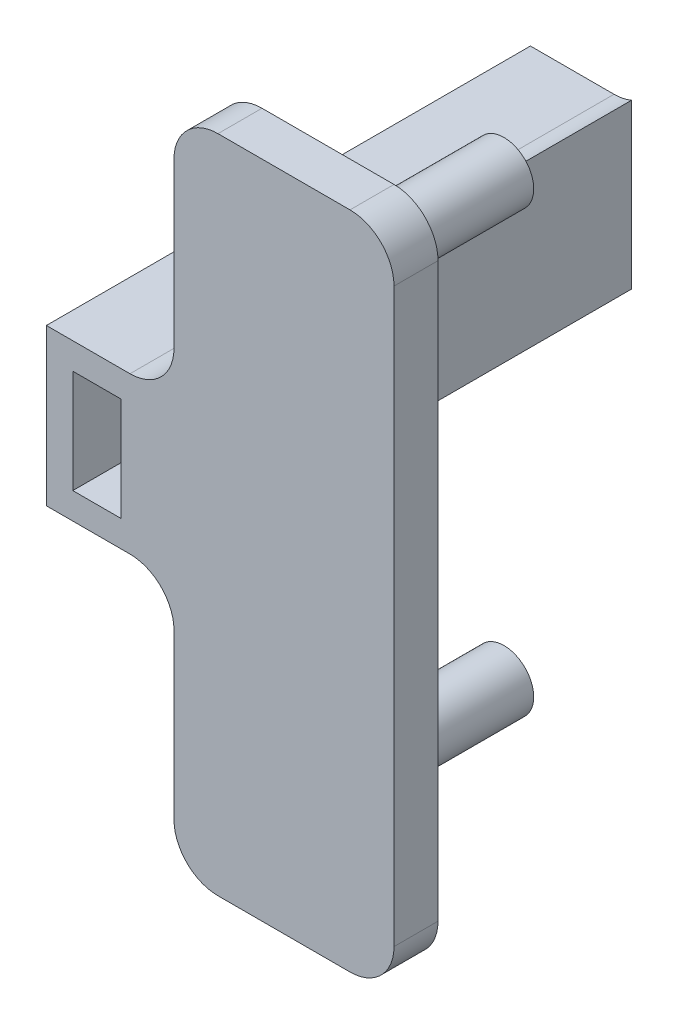
ISO-10303-21;
HEADER;
FILE_DESCRIPTION(('STEP AP214'),'2;1');
FILE_NAME('part.step','',(''),(''),'','','');
FILE_SCHEMA(('AUTOMOTIVE_DESIGN { 1 0 10303 214 1 1 1 1 }'));
ENDSEC;
DATA;
#1=APPLICATION_CONTEXT('core data for automotive mechanical design processes');
#2=APPLICATION_PROTOCOL_DEFINITION('international standard','automotive_design',2000,#1);
#3=PRODUCT_CONTEXT('',#1,'mechanical');
#4=PRODUCT('Part','Part','',(#3));
#5=PRODUCT_RELATED_PRODUCT_CATEGORY('part','',(#4));
#6=PRODUCT_DEFINITION_FORMATION('','',#4);
#7=PRODUCT_DEFINITION_CONTEXT('part definition',#1,'design');
#8=PRODUCT_DEFINITION('design','',#6,#7);
#9=PRODUCT_DEFINITION_SHAPE('','',#8);
#10=(LENGTH_UNIT() NAMED_UNIT(*) SI_UNIT(.MILLI.,.METRE.));
#11=(NAMED_UNIT(*) PLANE_ANGLE_UNIT() SI_UNIT($,.RADIAN.));
#12=(NAMED_UNIT(*) SI_UNIT($,.STERADIAN.) SOLID_ANGLE_UNIT());
#13=UNCERTAINTY_MEASURE_WITH_UNIT(LENGTH_MEASURE(1.E-05),#10,'distance_accuracy_value','');
#14=(GEOMETRIC_REPRESENTATION_CONTEXT(3) GLOBAL_UNCERTAINTY_ASSIGNED_CONTEXT((#13)) GLOBAL_UNIT_ASSIGNED_CONTEXT((#10,
#11,#12)) REPRESENTATION_CONTEXT('',''));
#15=CARTESIAN_POINT('',(0.,0.,0.));
#16=DIRECTION('',(0.,0.,1.));
#17=DIRECTION('',(1.,0.,0.));
#18=AXIS2_PLACEMENT_3D('',#15,#16,#17);
#19=CARTESIAN_POINT('',(0.,0.,0.));
#20=DIRECTION('',(0.,0.,-1.));
#21=DIRECTION('',(-1.,0.,0.));
#22=AXIS2_PLACEMENT_3D('',#19,#20,#21);
#23=PLANE('',#22);
#24=CARTESIAN_POINT('',(44.,65.,0.));
#25=DIRECTION('',(0.,0.,-1.));
#26=DIRECTION('',(-1.,0.,0.));
#27=AXIS2_PLACEMENT_3D('',#24,#25,#26);
#28=CIRCLE('',#27,1.35);
#29=CARTESIAN_POINT('',(42.65,65.,0.));
#30=VERTEX_POINT('',#29);
#31=EDGE_CURVE('E215',#30,#30,#28,.T.);
#32=ORIENTED_EDGE('',*,*,#31,.F.);
#33=EDGE_LOOP('',(#32));
#34=FACE_BOUND('',#33,.T.);
#35=CARTESIAN_POINT('',(44.,45.,0.));
#36=DIRECTION('',(0.,0.,-1.));
#37=DIRECTION('',(-1.,0.,0.));
#38=AXIS2_PLACEMENT_3D('',#35,#36,#37);
#39=CIRCLE('',#38,1.35);
#40=CARTESIAN_POINT('',(42.65,45.,0.));
#41=VERTEX_POINT('',#40);
#42=EDGE_CURVE('E222',#41,#41,#39,.T.);
#43=ORIENTED_EDGE('',*,*,#42,.F.);
#44=EDGE_LOOP('',(#43));
#45=FACE_BOUND('',#44,.T.);
#46=DIRECTION('',(0.,-1.,0.));
#47=VECTOR('',#46,1.);
#48=CARTESIAN_POINT('',(39.7,51.2830302779823,0.));
#49=LINE('',#48,#47);
#50=CARTESIAN_POINT('',(39.7,58.7169697220176,0.));
#51=VERTEX_POINT('',#50);
#52=CARTESIAN_POINT('',(39.7,51.2830302779823,0.));
#53=VERTEX_POINT('',#52);
#54=EDGE_CURVE('E52',#51,#53,#49,.T.);
#55=ORIENTED_EDGE('',*,*,#54,.F.);
#56=DIRECTION('',(1.,0.,0.));
#57=VECTOR('',#56,1.);
#58=CARTESIAN_POINT('',(39.7,58.7169697220176,0.));
#59=LINE('',#58,#57);
#60=CARTESIAN_POINT('',(37.8,58.7169697220176,0.));
#61=VERTEX_POINT('',#60);
#62=EDGE_CURVE('E211',#61,#51,#59,.T.);
#63=ORIENTED_EDGE('',*,*,#62,.F.);
#64=CARTESIAN_POINT('',(37.,60.55,0.));
#65=DIRECTION('',(0.,0.,-1.));
#66=DIRECTION('',(-1.,0.,0.));
#67=AXIS2_PLACEMENT_3D('',#64,#65,#66);
#68=CIRCLE('',#67,2.);
#69=CARTESIAN_POINT('',(39.,60.55,0.));
#70=VERTEX_POINT('',#69);
#71=EDGE_CURVE('E367',#61,#70,#68,.F.);
#72=ORIENTED_EDGE('',*,*,#71,.T.);
#73=DIRECTION('',(0.,-1.,0.));
#74=VECTOR('',#73,1.);
#75=CARTESIAN_POINT('',(39.,70.,0.));
#76=LINE('',#75,#74);
#77=CARTESIAN_POINT('',(39.,68.,0.));
#78=VERTEX_POINT('',#77);
#79=EDGE_CURVE('E303',#78,#70,#76,.T.);
#80=ORIENTED_EDGE('',*,*,#79,.F.);
#81=CARTESIAN_POINT('',(41.,68.,0.));
#82=DIRECTION('',(0.,0.,-1.));
#83=DIRECTION('',(-1.,0.,0.));
#84=AXIS2_PLACEMENT_3D('',#81,#82,#83);
#85=CIRCLE('',#84,2.);
#86=CARTESIAN_POINT('',(41.,70.,0.));
#87=VERTEX_POINT('',#86);
#88=EDGE_CURVE('E320',#78,#87,#85,.T.);
#89=ORIENTED_EDGE('',*,*,#88,.T.);
#90=DIRECTION('',(-1.,0.,0.));
#91=VECTOR('',#90,1.);
#92=CARTESIAN_POINT('',(49.,70.,0.));
#93=LINE('',#92,#91);
#94=CARTESIAN_POINT('',(47.,70.,0.));
#95=VERTEX_POINT('',#94);
#96=EDGE_CURVE('E300',#95,#87,#93,.T.);
#97=ORIENTED_EDGE('',*,*,#96,.F.);
#98=CARTESIAN_POINT('',(47.,68.,0.));
#99=DIRECTION('',(0.,0.,-1.));
#100=DIRECTION('',(-1.,0.,0.));
#101=AXIS2_PLACEMENT_3D('',#98,#99,#100);
#102=CIRCLE('',#101,2.);
#103=CARTESIAN_POINT('',(49.,68.,0.));
#104=VERTEX_POINT('',#103);
#105=EDGE_CURVE('E326',#95,#104,#102,.T.);
#106=ORIENTED_EDGE('',*,*,#105,.T.);
#107=DIRECTION('',(0.,1.,0.));
#108=VECTOR('',#107,1.);
#109=CARTESIAN_POINT('',(49.,70.,0.));
#110=LINE('',#109,#108);
#111=CARTESIAN_POINT('',(49.,42.,0.));
#112=VERTEX_POINT('',#111);
#113=EDGE_CURVE('E273',#112,#104,#110,.T.);
#114=ORIENTED_EDGE('',*,*,#113,.F.);
#115=CARTESIAN_POINT('',(47.,42.,0.));
#116=DIRECTION('',(0.,0.,-1.));
#117=DIRECTION('',(-1.,0.,0.));
#118=AXIS2_PLACEMENT_3D('',#115,#116,#117);
#119=CIRCLE('',#118,2.);
#120=CARTESIAN_POINT('',(47.,40.,0.));
#121=VERTEX_POINT('',#120);
#122=EDGE_CURVE('E324',#112,#121,#119,.T.);
#123=ORIENTED_EDGE('',*,*,#122,.T.);
#124=DIRECTION('',(1.,0.,0.));
#125=VECTOR('',#124,1.);
#126=CARTESIAN_POINT('',(49.,40.,0.));
#127=LINE('',#126,#125);
#128=CARTESIAN_POINT('',(41.,40.,0.));
#129=VERTEX_POINT('',#128);
#130=EDGE_CURVE('E278',#129,#121,#127,.T.);
#131=ORIENTED_EDGE('',*,*,#130,.F.);
#132=CARTESIAN_POINT('',(41.,42.,0.));
#133=DIRECTION('',(0.,0.,-1.));
#134=DIRECTION('',(-1.,0.,0.));
#135=AXIS2_PLACEMENT_3D('',#132,#133,#134);
#136=CIRCLE('',#135,2.);
#137=CARTESIAN_POINT('',(39.,42.,0.));
#138=VERTEX_POINT('',#137);
#139=EDGE_CURVE('E322',#129,#138,#136,.T.);
#140=ORIENTED_EDGE('',*,*,#139,.T.);
#141=DIRECTION('',(0.,-1.,0.));
#142=VECTOR('',#141,1.);
#143=CARTESIAN_POINT('',(39.,51.45,0.));
#144=LINE('',#143,#142);
#145=CARTESIAN_POINT('',(39.,49.45,0.));
#146=VERTEX_POINT('',#145);
#147=EDGE_CURVE('E306',#146,#138,#144,.T.);
#148=ORIENTED_EDGE('',*,*,#147,.F.);
#149=CARTESIAN_POINT('',(37.,49.45,0.));
#150=DIRECTION('',(0.,0.,-1.));
#151=DIRECTION('',(-1.,0.,0.));
#152=AXIS2_PLACEMENT_3D('',#149,#150,#151);
#153=CIRCLE('',#152,2.);
#154=CARTESIAN_POINT('',(37.8,51.2830302779823,0.));
#155=VERTEX_POINT('',#154);
#156=EDGE_CURVE('E371',#146,#155,#153,.F.);
#157=ORIENTED_EDGE('',*,*,#156,.T.);
#158=DIRECTION('',(-1.,0.,0.));
#159=VECTOR('',#158,1.);
#160=CARTESIAN_POINT('',(37.8,51.2830302779823,0.));
#161=LINE('',#160,#159);
#162=EDGE_CURVE('E57',#53,#155,#161,.T.);
#163=ORIENTED_EDGE('',*,*,#162,.F.);
#164=EDGE_LOOP('',(#55,#63,#72,#80,#89,#97,#106,#114,#123,#131,#140,#148,#157,#163));
#165=FACE_BOUND('',#164,.T.);
#166=ADVANCED_FACE('F37',(#34,#45,#165),#23,.T.);
#167=CARTESIAN_POINT('',(37.8,51.45,-20.));
#168=DIRECTION('',(-1.,0.,0.));
#169=DIRECTION('',(0.,0.,1.));
#170=AXIS2_PLACEMENT_3D('',#167,#168,#169);
#171=PLANE('',#170);
#172=DIRECTION('',(0.,1.,0.));
#173=VECTOR('',#172,1.);
#174=CARTESIAN_POINT('',(37.8,58.7169697220176,-8.));
#175=LINE('',#174,#173);
#176=CARTESIAN_POINT('',(37.8,51.2830302779823,-8.));
#177=VERTEX_POINT('',#176);
#178=CARTESIAN_POINT('',(37.8,58.7169697220176,-8.));
#179=VERTEX_POINT('',#178);
#180=EDGE_CURVE('E206',#177,#179,#175,.T.);
#181=ORIENTED_EDGE('',*,*,#180,.F.);
#182=DIRECTION('',(0.,0.,1.));
#183=VECTOR('',#182,1.);
#184=CARTESIAN_POINT('',(37.8,51.2830302779823,0.));
#185=LINE('',#184,#183);
#186=CARTESIAN_POINT('',(37.8,51.2830302779823,-20.));
#187=VERTEX_POINT('',#186);
#188=EDGE_CURVE('E373',#177,#187,#185,.F.);
#189=ORIENTED_EDGE('',*,*,#188,.T.);
#190=DIRECTION('',(0.,-1.,0.));
#191=VECTOR('',#190,1.);
#192=CARTESIAN_POINT('',(37.8,51.45,-20.));
#193=LINE('',#192,#191);
#194=CARTESIAN_POINT('',(37.8,58.7169697220176,-20.));
#195=VERTEX_POINT('',#194);
#196=EDGE_CURVE('E247',#195,#187,#193,.T.);
#197=ORIENTED_EDGE('',*,*,#196,.F.);
#198=DIRECTION('',(0.,0.,1.));
#199=VECTOR('',#198,1.);
#200=CARTESIAN_POINT('',(37.8,58.7169697220176,-20.));
#201=LINE('',#200,#199);
#202=EDGE_CURVE('E364',#195,#179,#201,.T.);
#203=ORIENTED_EDGE('',*,*,#202,.T.);
#204=EDGE_LOOP('',(#181,#189,#197,#203));
#205=FACE_BOUND('',#204,.T.);
#206=ADVANCED_FACE('F448',(#205),#171,.F.);
#207=CARTESIAN_POINT('',(34.4,57.35,2.));
#208=DIRECTION('',(1.,0.,0.));
#209=DIRECTION('',(0.,0.,-1.));
#210=AXIS2_PLACEMENT_3D('',#207,#208,#209);
#211=PLANE('',#210);
#212=DIRECTION('',(0.,0.,-1.));
#213=VECTOR('',#212,1.);
#214=CARTESIAN_POINT('',(34.4,52.65,2.));
#215=LINE('',#214,#213);
#216=CARTESIAN_POINT('',(34.4,52.65,2.));
#217=VERTEX_POINT('',#216);
#218=CARTESIAN_POINT('',(34.4,52.65,-19.));
#219=VERTEX_POINT('',#218);
#220=EDGE_CURVE('E270',#217,#219,#215,.T.);
#221=ORIENTED_EDGE('',*,*,#220,.T.);
#222=DIRECTION('',(0.,1.,0.));
#223=VECTOR('',#222,1.);
#224=CARTESIAN_POINT('',(34.4,52.65,-19.));
#225=LINE('',#224,#223);
#226=CARTESIAN_POINT('',(34.4,57.35,-19.));
#227=VERTEX_POINT('',#226);
#228=EDGE_CURVE('E227',#219,#227,#225,.T.);
#229=ORIENTED_EDGE('',*,*,#228,.T.);
#230=DIRECTION('',(0.,0.,-1.));
#231=VECTOR('',#230,1.);
#232=CARTESIAN_POINT('',(34.4,57.35,2.));
#233=LINE('',#232,#231);
#234=CARTESIAN_POINT('',(34.4,57.35,2.));
#235=VERTEX_POINT('',#234);
#236=EDGE_CURVE('E261',#235,#227,#233,.T.);
#237=ORIENTED_EDGE('',*,*,#236,.F.);
#238=DIRECTION('',(0.,-1.,0.));
#239=VECTOR('',#238,1.);
#240=CARTESIAN_POINT('',(34.4,57.35,2.));
#241=LINE('',#240,#239);
#242=EDGE_CURVE('E252',#235,#217,#241,.T.);
#243=ORIENTED_EDGE('',*,*,#242,.T.);
#244=EDGE_LOOP('',(#221,#229,#237,#243));
#245=FACE_BOUND('',#244,.T.);
#246=ADVANCED_FACE('F471',(#245),#211,.T.);
#247=CARTESIAN_POINT('',(36.6,52.65,2.));
#248=DIRECTION('',(0.,1.,0.));
#249=DIRECTION('',(0.,0.,1.));
#250=AXIS2_PLACEMENT_3D('',#247,#248,#249);
#251=PLANE('',#250);
#252=DIRECTION('',(0.,0.,-1.));
#253=VECTOR('',#252,1.);
#254=CARTESIAN_POINT('',(36.6,52.65,2.));
#255=LINE('',#254,#253);
#256=CARTESIAN_POINT('',(36.6,52.65,2.));
#257=VERTEX_POINT('',#256);
#258=CARTESIAN_POINT('',(36.6,52.65,-19.));
#259=VERTEX_POINT('',#258);
#260=EDGE_CURVE('E267',#257,#259,#255,.T.);
#261=ORIENTED_EDGE('',*,*,#260,.T.);
#262=DIRECTION('',(-1.,0.,0.));
#263=VECTOR('',#262,1.);
#264=CARTESIAN_POINT('',(36.6,52.65,-19.));
#265=LINE('',#264,#263);
#266=EDGE_CURVE('E238',#259,#219,#265,.T.);
#267=ORIENTED_EDGE('',*,*,#266,.T.);
#268=ORIENTED_EDGE('',*,*,#220,.F.);
#269=DIRECTION('',(1.,0.,0.));
#270=VECTOR('',#269,1.);
#271=CARTESIAN_POINT('',(36.6,52.65,2.));
#272=LINE('',#271,#270);
#273=EDGE_CURVE('E254',#217,#257,#272,.T.);
#274=ORIENTED_EDGE('',*,*,#273,.T.);
#275=EDGE_LOOP('',(#261,#267,#268,#274));
#276=FACE_BOUND('',#275,.T.);
#277=ADVANCED_FACE('F541',(#276),#251,.T.);
#278=CARTESIAN_POINT('',(36.6,57.35,2.));
#279=DIRECTION('',(-1.,0.,0.));
#280=DIRECTION('',(0.,0.,1.));
#281=AXIS2_PLACEMENT_3D('',#278,#279,#280);
#282=PLANE('',#281);
#283=DIRECTION('',(0.,0.,-1.));
#284=VECTOR('',#283,1.);
#285=CARTESIAN_POINT('',(36.6,57.35,2.));
#286=LINE('',#285,#284);
#287=CARTESIAN_POINT('',(36.6,57.35,2.));
#288=VERTEX_POINT('',#287);
#289=CARTESIAN_POINT('',(36.6,57.35,-19.));
#290=VERTEX_POINT('',#289);
#291=EDGE_CURVE('E264',#288,#290,#286,.T.);
#292=ORIENTED_EDGE('',*,*,#291,.T.);
#293=DIRECTION('',(0.,-1.,0.));
#294=VECTOR('',#293,1.);
#295=CARTESIAN_POINT('',(36.6,57.35,-19.));
#296=LINE('',#295,#294);
#297=EDGE_CURVE('E235',#290,#259,#296,.T.);
#298=ORIENTED_EDGE('',*,*,#297,.T.);
#299=ORIENTED_EDGE('',*,*,#260,.F.);
#300=DIRECTION('',(0.,1.,0.));
#301=VECTOR('',#300,1.);
#302=CARTESIAN_POINT('',(36.6,57.35,2.));
#303=LINE('',#302,#301);
#304=EDGE_CURVE('E256',#257,#288,#303,.T.);
#305=ORIENTED_EDGE('',*,*,#304,.T.);
#306=EDGE_LOOP('',(#292,#298,#299,#305));
#307=FACE_BOUND('',#306,.T.);
#308=ADVANCED_FACE('F537',(#307),#282,.T.);
#309=CARTESIAN_POINT('',(36.6,57.35,2.));
#310=DIRECTION('',(0.,-1.,0.));
#311=DIRECTION('',(0.,0.,-1.));
#312=AXIS2_PLACEMENT_3D('',#309,#310,#311);
#313=PLANE('',#312);
#314=ORIENTED_EDGE('',*,*,#236,.T.);
#315=DIRECTION('',(1.,0.,0.));
#316=VECTOR('',#315,1.);
#317=CARTESIAN_POINT('',(34.4,57.35,-19.));
#318=LINE('',#317,#316);
#319=EDGE_CURVE('E232',#227,#290,#318,.T.);
#320=ORIENTED_EDGE('',*,*,#319,.T.);
#321=ORIENTED_EDGE('',*,*,#291,.F.);
#322=DIRECTION('',(-1.,0.,0.));
#323=VECTOR('',#322,1.);
#324=CARTESIAN_POINT('',(36.6,57.35,2.));
#325=LINE('',#324,#323);
#326=EDGE_CURVE('E259',#288,#235,#325,.T.);
#327=ORIENTED_EDGE('',*,*,#326,.T.);
#328=EDGE_LOOP('',(#314,#320,#321,#327));
#329=FACE_BOUND('',#328,.T.);
#330=ADVANCED_FACE('F534',(#329),#313,.T.);
#331=CARTESIAN_POINT('',(0.,0.,2.));
#332=DIRECTION('',(0.,0.,-1.));
#333=DIRECTION('',(-1.,0.,0.));
#334=AXIS2_PLACEMENT_3D('',#331,#332,#333);
#335=PLANE('',#334);
#336=DIRECTION('',(0.,1.,0.));
#337=VECTOR('',#336,1.);
#338=CARTESIAN_POINT('',(49.,70.,2.));
#339=LINE('',#338,#337);
#340=CARTESIAN_POINT('',(49.,42.,2.));
#341=VERTEX_POINT('',#340);
#342=CARTESIAN_POINT('',(49.,68.,2.));
#343=VERTEX_POINT('',#342);
#344=EDGE_CURVE('E274',#341,#343,#339,.T.);
#345=ORIENTED_EDGE('',*,*,#344,.T.);
#346=CARTESIAN_POINT('',(47.,68.,2.));
#347=DIRECTION('',(0.,0.,-1.));
#348=DIRECTION('',(-1.,0.,0.));
#349=AXIS2_PLACEMENT_3D('',#346,#347,#348);
#350=CIRCLE('',#349,2.);
#351=CARTESIAN_POINT('',(47.,70.,2.));
#352=VERTEX_POINT('',#351);
#353=EDGE_CURVE('E339',#343,#352,#350,.F.);
#354=ORIENTED_EDGE('',*,*,#353,.T.);
#355=DIRECTION('',(-1.,0.,0.));
#356=VECTOR('',#355,1.);
#357=CARTESIAN_POINT('',(49.,70.,2.));
#358=LINE('',#357,#356);
#359=CARTESIAN_POINT('',(41.,70.,2.));
#360=VERTEX_POINT('',#359);
#361=EDGE_CURVE('E277',#352,#360,#358,.T.);
#362=ORIENTED_EDGE('',*,*,#361,.T.);
#363=CARTESIAN_POINT('',(41.,68.,2.));
#364=DIRECTION('',(0.,0.,-1.));
#365=DIRECTION('',(-1.,0.,0.));
#366=AXIS2_PLACEMENT_3D('',#363,#364,#365);
#367=CIRCLE('',#366,2.);
#368=CARTESIAN_POINT('',(39.,68.,2.));
#369=VERTEX_POINT('',#368);
#370=EDGE_CURVE('E333',#360,#369,#367,.F.);
#371=ORIENTED_EDGE('',*,*,#370,.T.);
#372=DIRECTION('',(0.,-1.,0.));
#373=VECTOR('',#372,1.);
#374=CARTESIAN_POINT('',(39.,70.,2.));
#375=LINE('',#374,#373);
#376=CARTESIAN_POINT('',(39.,60.55,2.));
#377=VERTEX_POINT('',#376);
#378=EDGE_CURVE('E281',#369,#377,#375,.T.);
#379=ORIENTED_EDGE('',*,*,#378,.T.);
#380=CARTESIAN_POINT('',(37.,60.55,2.));
#381=DIRECTION('',(0.,0.,-1.));
#382=DIRECTION('',(-1.,0.,0.));
#383=AXIS2_PLACEMENT_3D('',#380,#381,#382);
#384=CIRCLE('',#383,2.);
#385=CARTESIAN_POINT('',(37.,58.55,2.));
#386=VERTEX_POINT('',#385);
#387=EDGE_CURVE('E369',#377,#386,#384,.T.);
#388=ORIENTED_EDGE('',*,*,#387,.T.);
#389=DIRECTION('',(-1.,0.,0.));
#390=VECTOR('',#389,1.);
#391=CARTESIAN_POINT('',(33.2,58.55,2.));
#392=LINE('',#391,#390);
#393=CARTESIAN_POINT('',(33.2,58.55,2.));
#394=VERTEX_POINT('',#393);
#395=EDGE_CURVE('E284',#386,#394,#392,.T.);
#396=ORIENTED_EDGE('',*,*,#395,.T.);
#397=DIRECTION('',(0.,-1.,0.));
#398=VECTOR('',#397,1.);
#399=CARTESIAN_POINT('',(33.2,58.55,2.));
#400=LINE('',#399,#398);
#401=CARTESIAN_POINT('',(33.2,51.45,2.));
#402=VERTEX_POINT('',#401);
#403=EDGE_CURVE('E286',#394,#402,#400,.T.);
#404=ORIENTED_EDGE('',*,*,#403,.T.);
#405=DIRECTION('',(1.,0.,0.));
#406=VECTOR('',#405,1.);
#407=CARTESIAN_POINT('',(33.2,51.45,2.));
#408=LINE('',#407,#406);
#409=CARTESIAN_POINT('',(37.,51.45,2.));
#410=VERTEX_POINT('',#409);
#411=EDGE_CURVE('E288',#402,#410,#408,.T.);
#412=ORIENTED_EDGE('',*,*,#411,.T.);
#413=CARTESIAN_POINT('',(37.,49.45,2.));
#414=DIRECTION('',(0.,0.,-1.));
#415=DIRECTION('',(-1.,0.,0.));
#416=AXIS2_PLACEMENT_3D('',#413,#414,#415);
#417=CIRCLE('',#416,2.);
#418=CARTESIAN_POINT('',(39.,49.45,2.));
#419=VERTEX_POINT('',#418);
#420=EDGE_CURVE('E11',#410,#419,#417,.T.);
#421=ORIENTED_EDGE('',*,*,#420,.T.);
#422=DIRECTION('',(0.,-1.,0.));
#423=VECTOR('',#422,1.);
#424=CARTESIAN_POINT('',(39.,51.45,2.));
#425=LINE('',#424,#423);
#426=CARTESIAN_POINT('',(39.,42.,2.));
#427=VERTEX_POINT('',#426);
#428=EDGE_CURVE('E291',#419,#427,#425,.T.);
#429=ORIENTED_EDGE('',*,*,#428,.T.);
#430=CARTESIAN_POINT('',(41.,42.,2.));
#431=DIRECTION('',(0.,0.,-1.));
#432=DIRECTION('',(-1.,0.,0.));
#433=AXIS2_PLACEMENT_3D('',#430,#431,#432);
#434=CIRCLE('',#433,2.);
#435=CARTESIAN_POINT('',(41.,40.,2.));
#436=VERTEX_POINT('',#435);
#437=EDGE_CURVE('E335',#427,#436,#434,.F.);
#438=ORIENTED_EDGE('',*,*,#437,.T.);
#439=DIRECTION('',(1.,0.,0.));
#440=VECTOR('',#439,1.);
#441=CARTESIAN_POINT('',(49.,40.,2.));
#442=LINE('',#441,#440);
#443=CARTESIAN_POINT('',(47.,40.,2.));
#444=VERTEX_POINT('',#443);
#445=EDGE_CURVE('E294',#436,#444,#442,.T.);
#446=ORIENTED_EDGE('',*,*,#445,.T.);
#447=CARTESIAN_POINT('',(47.,42.,2.));
#448=DIRECTION('',(0.,0.,-1.));
#449=DIRECTION('',(-1.,0.,0.));
#450=AXIS2_PLACEMENT_3D('',#447,#448,#449);
#451=CIRCLE('',#450,2.);
#452=EDGE_CURVE('E337',#444,#341,#451,.F.);
#453=ORIENTED_EDGE('',*,*,#452,.T.);
#454=EDGE_LOOP('',(#345,#354,#362,#371,#379,#388,#396,#404,#412,#421,#429,#438,#446,#453));
#455=FACE_BOUND('',#454,.T.);
#456=ORIENTED_EDGE('',*,*,#242,.F.);
#457=ORIENTED_EDGE('',*,*,#326,.F.);
#458=ORIENTED_EDGE('',*,*,#304,.F.);
#459=ORIENTED_EDGE('',*,*,#273,.F.);
#460=EDGE_LOOP('',(#456,#457,#458,#459));
#461=FACE_BOUND('',#460,.T.);
#462=ADVANCED_FACE('F391',(#455,#461),#335,.F.);
#463=CARTESIAN_POINT('',(49.,70.,2.));
#464=DIRECTION('',(-1.,0.,0.));
#465=DIRECTION('',(0.,-1.,0.));
#466=AXIS2_PLACEMENT_3D('',#463,#464,#465);
#467=PLANE('',#466);
#468=ORIENTED_EDGE('',*,*,#113,.T.);
#469=DIRECTION('',(0.,0.,-1.));
#470=VECTOR('',#469,1.);
#471=CARTESIAN_POINT('',(49.,68.,2.));
#472=LINE('',#471,#470);
#473=EDGE_CURVE('E331',#104,#343,#472,.F.);
#474=ORIENTED_EDGE('',*,*,#473,.T.);
#475=ORIENTED_EDGE('',*,*,#344,.F.);
#476=DIRECTION('',(0.,0.,-1.));
#477=VECTOR('',#476,1.);
#478=CARTESIAN_POINT('',(49.,42.,2.));
#479=LINE('',#478,#477);
#480=EDGE_CURVE('E328',#341,#112,#479,.T.);
#481=ORIENTED_EDGE('',*,*,#480,.T.);
#482=EDGE_LOOP('',(#468,#474,#475,#481));
#483=FACE_BOUND('',#482,.T.);
#484=ADVANCED_FACE('F413',(#483),#467,.F.);
#485=CARTESIAN_POINT('',(49.,70.,2.));
#486=DIRECTION('',(0.,-1.,0.));
#487=DIRECTION('',(0.,0.,-1.));
#488=AXIS2_PLACEMENT_3D('',#485,#486,#487);
#489=PLANE('',#488);
#490=ORIENTED_EDGE('',*,*,#361,.F.);
#491=DIRECTION('',(0.,0.,-1.));
#492=VECTOR('',#491,1.);
#493=CARTESIAN_POINT('',(47.,70.,2.));
#494=LINE('',#493,#492);
#495=EDGE_CURVE('E317',#352,#95,#494,.T.);
#496=ORIENTED_EDGE('',*,*,#495,.T.);
#497=ORIENTED_EDGE('',*,*,#96,.T.);
#498=DIRECTION('',(0.,0.,-1.));
#499=VECTOR('',#498,1.);
#500=CARTESIAN_POINT('',(41.,70.,2.));
#501=LINE('',#500,#499);
#502=EDGE_CURVE('E315',#87,#360,#501,.F.);
#503=ORIENTED_EDGE('',*,*,#502,.T.);
#504=EDGE_LOOP('',(#490,#496,#497,#503));
#505=FACE_BOUND('',#504,.T.);
#506=ADVANCED_FACE('F422',(#505),#489,.F.);
#507=CARTESIAN_POINT('',(39.,70.,2.));
#508=DIRECTION('',(1.,0.,0.));
#509=DIRECTION('',(0.,0.,-1.));
#510=AXIS2_PLACEMENT_3D('',#507,#508,#509);
#511=PLANE('',#510);
#512=ORIENTED_EDGE('',*,*,#378,.F.);
#513=DIRECTION('',(0.,0.,-1.));
#514=VECTOR('',#513,1.);
#515=CARTESIAN_POINT('',(39.,68.,2.));
#516=LINE('',#515,#514);
#517=EDGE_CURVE('E353',#369,#78,#516,.T.);
#518=ORIENTED_EDGE('',*,*,#517,.T.);
#519=ORIENTED_EDGE('',*,*,#79,.T.);
#520=DIRECTION('',(0.,0.,-1.));
#521=VECTOR('',#520,1.);
#522=CARTESIAN_POINT('',(39.,60.55,2.));
#523=LINE('',#522,#521);
#524=EDGE_CURVE('E351',#70,#377,#523,.F.);
#525=ORIENTED_EDGE('',*,*,#524,.T.);
#526=EDGE_LOOP('',(#512,#518,#519,#525));
#527=FACE_BOUND('',#526,.T.);
#528=ADVANCED_FACE('F431',(#527),#511,.F.);
#529=CARTESIAN_POINT('',(33.2,58.55,2.));
#530=DIRECTION('',(0.,-1.,0.));
#531=DIRECTION('',(0.,0.,-1.));
#532=AXIS2_PLACEMENT_3D('',#529,#530,#531);
#533=PLANE('',#532);
#534=ORIENTED_EDGE('',*,*,#395,.F.);
#535=DIRECTION('',(0.,0.,-1.));
#536=VECTOR('',#535,1.);
#537=CARTESIAN_POINT('',(37.,58.55,0.));
#538=LINE('',#537,#536);
#539=CARTESIAN_POINT('',(37.,58.55,-20.));
#540=VERTEX_POINT('',#539);
#541=EDGE_CURVE('E356',#386,#540,#538,.T.);
#542=ORIENTED_EDGE('',*,*,#541,.T.);
#543=DIRECTION('',(1.,0.,0.));
#544=VECTOR('',#543,1.);
#545=CARTESIAN_POINT('',(33.2,58.55,-20.));
#546=LINE('',#545,#544);
#547=CARTESIAN_POINT('',(33.2,58.55,-20.));
#548=VERTEX_POINT('',#547);
#549=EDGE_CURVE('E244',#548,#540,#546,.T.);
#550=ORIENTED_EDGE('',*,*,#549,.F.);
#551=DIRECTION('',(0.,0.,-1.));
#552=VECTOR('',#551,1.);
#553=CARTESIAN_POINT('',(33.2,58.55,2.));
#554=LINE('',#553,#552);
#555=EDGE_CURVE('E313',#394,#548,#554,.T.);
#556=ORIENTED_EDGE('',*,*,#555,.F.);
#557=EDGE_LOOP('',(#534,#542,#550,#556));
#558=FACE_BOUND('',#557,.T.);
#559=ADVANCED_FACE('F441',(#558),#533,.F.);
#560=CARTESIAN_POINT('',(33.2,58.55,2.));
#561=DIRECTION('',(1.,0.,0.));
#562=DIRECTION('',(0.,0.,-1.));
#563=AXIS2_PLACEMENT_3D('',#560,#561,#562);
#564=PLANE('',#563);
#565=ORIENTED_EDGE('',*,*,#555,.T.);
#566=DIRECTION('',(0.,1.,0.));
#567=VECTOR('',#566,1.);
#568=CARTESIAN_POINT('',(33.2,51.45,-20.));
#569=LINE('',#568,#567);
#570=CARTESIAN_POINT('',(33.2,51.45,-20.));
#571=VERTEX_POINT('',#570);
#572=EDGE_CURVE('E241',#571,#548,#569,.T.);
#573=ORIENTED_EDGE('',*,*,#572,.F.);
#574=DIRECTION('',(0.,0.,-1.));
#575=VECTOR('',#574,1.);
#576=CARTESIAN_POINT('',(33.2,51.45,2.));
#577=LINE('',#576,#575);
#578=EDGE_CURVE('E297',#402,#571,#577,.T.);
#579=ORIENTED_EDGE('',*,*,#578,.F.);
#580=ORIENTED_EDGE('',*,*,#403,.F.);
#581=EDGE_LOOP('',(#565,#573,#579,#580));
#582=FACE_BOUND('',#581,.T.);
#583=ADVANCED_FACE('F445',(#582),#564,.F.);
#584=CARTESIAN_POINT('',(33.2,51.45,2.));
#585=DIRECTION('',(0.,1.,0.));
#586=DIRECTION('',(0.,0.,1.));
#587=AXIS2_PLACEMENT_3D('',#584,#585,#586);
#588=PLANE('',#587);
#589=DIRECTION('',(-1.,0.,0.));
#590=VECTOR('',#589,1.);
#591=CARTESIAN_POINT('',(33.2,51.45,-20.));
#592=LINE('',#591,#590);
#593=CARTESIAN_POINT('',(37.,51.45,-20.));
#594=VERTEX_POINT('',#593);
#595=EDGE_CURVE('E250',#594,#571,#592,.T.);
#596=ORIENTED_EDGE('',*,*,#595,.F.);
#597=DIRECTION('',(0.,0.,-1.));
#598=VECTOR('',#597,1.);
#599=CARTESIAN_POINT('',(37.,51.45,2.));
#600=LINE('',#599,#598);
#601=EDGE_CURVE('E359',#594,#410,#600,.F.);
#602=ORIENTED_EDGE('',*,*,#601,.T.);
#603=ORIENTED_EDGE('',*,*,#411,.F.);
#604=ORIENTED_EDGE('',*,*,#578,.T.);
#605=EDGE_LOOP('',(#596,#602,#603,#604));
#606=FACE_BOUND('',#605,.T.);
#607=ADVANCED_FACE('F383',(#606),#588,.F.);
#608=CARTESIAN_POINT('',(39.,51.45,2.));
#609=DIRECTION('',(1.,0.,0.));
#610=DIRECTION('',(0.,0.,-1.));
#611=AXIS2_PLACEMENT_3D('',#608,#609,#610);
#612=PLANE('',#611);
#613=ORIENTED_EDGE('',*,*,#147,.T.);
#614=DIRECTION('',(0.,0.,-1.));
#615=VECTOR('',#614,1.);
#616=CARTESIAN_POINT('',(39.,42.,2.));
#617=LINE('',#616,#615);
#618=EDGE_CURVE('E349',#138,#427,#617,.F.);
#619=ORIENTED_EDGE('',*,*,#618,.T.);
#620=ORIENTED_EDGE('',*,*,#428,.F.);
#621=DIRECTION('',(0.,0.,-1.));
#622=VECTOR('',#621,1.);
#623=CARTESIAN_POINT('',(39.,49.45,0.));
#624=LINE('',#623,#622);
#625=EDGE_CURVE('E346',#419,#146,#624,.T.);
#626=ORIENTED_EDGE('',*,*,#625,.T.);
#627=EDGE_LOOP('',(#613,#619,#620,#626));
#628=FACE_BOUND('',#627,.T.);
#629=ADVANCED_FACE('F395',(#628),#612,.F.);
#630=CARTESIAN_POINT('',(49.,40.,2.));
#631=DIRECTION('',(0.,1.,0.));
#632=DIRECTION('',(0.,0.,1.));
#633=AXIS2_PLACEMENT_3D('',#630,#631,#632);
#634=PLANE('',#633);
#635=ORIENTED_EDGE('',*,*,#130,.T.);
#636=DIRECTION('',(0.,0.,-1.));
#637=VECTOR('',#636,1.);
#638=CARTESIAN_POINT('',(47.,40.,2.));
#639=LINE('',#638,#637);
#640=EDGE_CURVE('E344',#121,#444,#639,.F.);
#641=ORIENTED_EDGE('',*,*,#640,.T.);
#642=ORIENTED_EDGE('',*,*,#445,.F.);
#643=DIRECTION('',(0.,0.,-1.));
#644=VECTOR('',#643,1.);
#645=CARTESIAN_POINT('',(41.,40.,2.));
#646=LINE('',#645,#644);
#647=EDGE_CURVE('E341',#436,#129,#646,.T.);
#648=ORIENTED_EDGE('',*,*,#647,.T.);
#649=EDGE_LOOP('',(#635,#641,#642,#648));
#650=FACE_BOUND('',#649,.T.);
#651=ADVANCED_FACE('F404',(#650),#634,.F.);
#652=CARTESIAN_POINT('',(0.,0.,-20.));
#653=DIRECTION('',(0.,0.,-1.));
#654=DIRECTION('',(-1.,0.,0.));
#655=AXIS2_PLACEMENT_3D('',#652,#653,#654);
#656=PLANE('',#655);
#657=ORIENTED_EDGE('',*,*,#572,.T.);
#658=ORIENTED_EDGE('',*,*,#549,.T.);
#659=CARTESIAN_POINT('',(37.,60.55,-20.));
#660=DIRECTION('',(0.,0.,-1.));
#661=DIRECTION('',(-1.,0.,0.));
#662=AXIS2_PLACEMENT_3D('',#659,#660,#661);
#663=CIRCLE('',#662,2.);
#664=EDGE_CURVE('E361',#540,#195,#663,.F.);
#665=ORIENTED_EDGE('',*,*,#664,.T.);
#666=ORIENTED_EDGE('',*,*,#196,.T.);
#667=CARTESIAN_POINT('',(37.,49.45,-20.));
#668=DIRECTION('',(0.,0.,-1.));
#669=DIRECTION('',(-1.,0.,0.));
#670=AXIS2_PLACEMENT_3D('',#667,#668,#669);
#671=CIRCLE('',#670,2.);
#672=EDGE_CURVE('E45',#187,#594,#671,.F.);
#673=ORIENTED_EDGE('',*,*,#672,.T.);
#674=ORIENTED_EDGE('',*,*,#595,.T.);
#675=EDGE_LOOP('',(#657,#658,#665,#666,#673,#674));
#676=FACE_BOUND('',#675,.T.);
#677=ADVANCED_FACE('F379',(#676),#656,.T.);
#678=CARTESIAN_POINT('',(0.,0.,-19.));
#679=DIRECTION('',(0.,0.,-1.));
#680=DIRECTION('',(-1.,0.,0.));
#681=AXIS2_PLACEMENT_3D('',#678,#679,#680);
#682=PLANE('',#681);
#683=ORIENTED_EDGE('',*,*,#228,.F.);
#684=ORIENTED_EDGE('',*,*,#266,.F.);
#685=ORIENTED_EDGE('',*,*,#297,.F.);
#686=ORIENTED_EDGE('',*,*,#319,.F.);
#687=EDGE_LOOP('',(#683,#684,#685,#686));
#688=FACE_BOUND('',#687,.T.);
#689=ADVANCED_FACE('F527',(#688),#682,.F.);
#690=CARTESIAN_POINT('',(44.,45.,-8.));
#691=DIRECTION('',(0.,0.,1.));
#692=DIRECTION('',(1.,0.,0.));
#693=AXIS2_PLACEMENT_3D('',#690,#691,#692);
#694=CYLINDRICAL_SURFACE('',#693,1.35);
#695=CARTESIAN_POINT('',(44.,45.,-8.));
#696=DIRECTION('',(0.,0.,-1.));
#697=DIRECTION('',(-1.,0.,0.));
#698=AXIS2_PLACEMENT_3D('',#695,#696,#697);
#699=CIRCLE('',#698,1.35);
#700=CARTESIAN_POINT('',(42.65,45.,-8.));
#701=VERTEX_POINT('',#700);
#702=EDGE_CURVE('E224',#701,#701,#699,.T.);
#703=ORIENTED_EDGE('',*,*,#702,.F.);
#704=EDGE_LOOP('',(#703));
#705=FACE_BOUND('',#704,.T.);
#706=ORIENTED_EDGE('',*,*,#42,.T.);
#707=EDGE_LOOP('',(#706));
#708=FACE_BOUND('',#707,.T.);
#709=ADVANCED_FACE('F523',(#705,#708),#694,.T.);
#710=CARTESIAN_POINT('',(44.,45.,-8.));
#711=DIRECTION('',(0.,0.,-1.));
#712=DIRECTION('',(-1.,0.,0.));
#713=AXIS2_PLACEMENT_3D('',#710,#711,#712);
#714=PLANE('',#713);
#715=ORIENTED_EDGE('',*,*,#702,.T.);
#716=EDGE_LOOP('',(#715));
#717=FACE_BOUND('',#716,.T.);
#718=ADVANCED_FACE('F516',(#717),#714,.T.);
#719=CARTESIAN_POINT('',(44.,65.,-8.));
#720=DIRECTION('',(0.,0.,1.));
#721=DIRECTION('',(1.,0.,0.));
#722=AXIS2_PLACEMENT_3D('',#719,#720,#721);
#723=CYLINDRICAL_SURFACE('',#722,1.35);
#724=CARTESIAN_POINT('',(44.,65.,-8.));
#725=DIRECTION('',(0.,0.,-1.));
#726=DIRECTION('',(-1.,0.,0.));
#727=AXIS2_PLACEMENT_3D('',#724,#725,#726);
#728=CIRCLE('',#727,1.35);
#729=CARTESIAN_POINT('',(42.65,65.,-8.));
#730=VERTEX_POINT('',#729);
#731=EDGE_CURVE('E212',#730,#730,#728,.T.);
#732=ORIENTED_EDGE('',*,*,#731,.F.);
#733=EDGE_LOOP('',(#732));
#734=FACE_BOUND('',#733,.T.);
#735=ORIENTED_EDGE('',*,*,#31,.T.);
#736=EDGE_LOOP('',(#735));
#737=FACE_BOUND('',#736,.T.);
#738=ADVANCED_FACE('F513',(#734,#737),#723,.T.);
#739=CARTESIAN_POINT('',(44.,65.,-8.));
#740=DIRECTION('',(0.,0.,-1.));
#741=DIRECTION('',(-1.,0.,0.));
#742=AXIS2_PLACEMENT_3D('',#739,#740,#741);
#743=PLANE('',#742);
#744=ORIENTED_EDGE('',*,*,#731,.T.);
#745=EDGE_LOOP('',(#744));
#746=FACE_BOUND('',#745,.T.);
#747=ADVANCED_FACE('F496',(#746),#743,.T.);
#748=CARTESIAN_POINT('',(47.,68.,2.));
#749=DIRECTION('',(0.,0.,-1.));
#750=DIRECTION('',(-1.,0.,0.));
#751=AXIS2_PLACEMENT_3D('',#748,#749,#750);
#752=CYLINDRICAL_SURFACE('',#751,2.);
#753=ORIENTED_EDGE('',*,*,#353,.F.);
#754=ORIENTED_EDGE('',*,*,#473,.F.);
#755=ORIENTED_EDGE('',*,*,#105,.F.);
#756=ORIENTED_EDGE('',*,*,#495,.F.);
#757=EDGE_LOOP('',(#753,#754,#755,#756));
#758=FACE_BOUND('',#757,.T.);
#759=ADVANCED_FACE('F417',(#758),#752,.T.);
#760=CARTESIAN_POINT('',(47.,42.,2.));
#761=DIRECTION('',(0.,0.,-1.));
#762=DIRECTION('',(-1.,0.,0.));
#763=AXIS2_PLACEMENT_3D('',#760,#761,#762);
#764=CYLINDRICAL_SURFACE('',#763,2.);
#765=ORIENTED_EDGE('',*,*,#452,.F.);
#766=ORIENTED_EDGE('',*,*,#640,.F.);
#767=ORIENTED_EDGE('',*,*,#122,.F.);
#768=ORIENTED_EDGE('',*,*,#480,.F.);
#769=EDGE_LOOP('',(#765,#766,#767,#768));
#770=FACE_BOUND('',#769,.T.);
#771=ADVANCED_FACE('F408',(#770),#764,.T.);
#772=CARTESIAN_POINT('',(41.,42.,2.));
#773=DIRECTION('',(0.,0.,-1.));
#774=DIRECTION('',(-1.,0.,0.));
#775=AXIS2_PLACEMENT_3D('',#772,#773,#774);
#776=CYLINDRICAL_SURFACE('',#775,2.);
#777=ORIENTED_EDGE('',*,*,#437,.F.);
#778=ORIENTED_EDGE('',*,*,#618,.F.);
#779=ORIENTED_EDGE('',*,*,#139,.F.);
#780=ORIENTED_EDGE('',*,*,#647,.F.);
#781=EDGE_LOOP('',(#777,#778,#779,#780));
#782=FACE_BOUND('',#781,.T.);
#783=ADVANCED_FACE('F399',(#782),#776,.T.);
#784=CARTESIAN_POINT('',(41.,68.,2.));
#785=DIRECTION('',(0.,0.,-1.));
#786=DIRECTION('',(-1.,0.,0.));
#787=AXIS2_PLACEMENT_3D('',#784,#785,#786);
#788=CYLINDRICAL_SURFACE('',#787,2.);
#789=ORIENTED_EDGE('',*,*,#370,.F.);
#790=ORIENTED_EDGE('',*,*,#502,.F.);
#791=ORIENTED_EDGE('',*,*,#88,.F.);
#792=ORIENTED_EDGE('',*,*,#517,.F.);
#793=EDGE_LOOP('',(#789,#790,#791,#792));
#794=FACE_BOUND('',#793,.T.);
#795=ADVANCED_FACE('F426',(#794),#788,.T.);
#796=CARTESIAN_POINT('',(37.,60.55,2.));
#797=DIRECTION('',(0.,0.,1.));
#798=DIRECTION('',(1.,0.,0.));
#799=AXIS2_PLACEMENT_3D('',#796,#797,#798);
#800=CYLINDRICAL_SURFACE('',#799,2.);
#801=ORIENTED_EDGE('',*,*,#387,.F.);
#802=ORIENTED_EDGE('',*,*,#524,.F.);
#803=ORIENTED_EDGE('',*,*,#71,.F.);
#804=DIRECTION('',(0.,0.,1.));
#805=VECTOR('',#804,1.);
#806=CARTESIAN_POINT('',(37.8,58.7169697220176,-8.));
#807=LINE('',#806,#805);
#808=EDGE_CURVE('E217',#179,#61,#807,.T.);
#809=ORIENTED_EDGE('',*,*,#808,.F.);
#810=ORIENTED_EDGE('',*,*,#202,.F.);
#811=ORIENTED_EDGE('',*,*,#664,.F.);
#812=ORIENTED_EDGE('',*,*,#541,.F.);
#813=EDGE_LOOP('',(#801,#802,#803,#809,#810,#811,#812));
#814=FACE_BOUND('',#813,.T.);
#815=ADVANCED_FACE('F436',(#814),#800,.F.);
#816=CARTESIAN_POINT('',(37.,49.45,2.));
#817=DIRECTION('',(0.,0.,1.));
#818=DIRECTION('',(1.,0.,0.));
#819=AXIS2_PLACEMENT_3D('',#816,#817,#818);
#820=CYLINDRICAL_SURFACE('',#819,2.);
#821=ORIENTED_EDGE('',*,*,#420,.F.);
#822=ORIENTED_EDGE('',*,*,#601,.F.);
#823=ORIENTED_EDGE('',*,*,#672,.F.);
#824=ORIENTED_EDGE('',*,*,#188,.F.);
#825=EDGE_CURVE('E374',#155,#177,#185,.F.);
#826=ORIENTED_EDGE('',*,*,#825,.F.);
#827=ORIENTED_EDGE('',*,*,#156,.F.);
#828=ORIENTED_EDGE('',*,*,#625,.F.);
#829=EDGE_LOOP('',(#821,#822,#823,#824,#826,#827,#828));
#830=FACE_BOUND('',#829,.T.);
#831=ADVANCED_FACE('F39',(#830),#820,.F.);
#832=CARTESIAN_POINT('',(39.7,58.7169697220176,-8.));
#833=DIRECTION('',(0.,-1.,0.));
#834=DIRECTION('',(0.,0.,-1.));
#835=AXIS2_PLACEMENT_3D('',#832,#833,#834);
#836=PLANE('',#835);
#837=ORIENTED_EDGE('',*,*,#62,.T.);
#838=DIRECTION('',(0.,0.,1.));
#839=VECTOR('',#838,1.);
#840=CARTESIAN_POINT('',(39.7,58.7169697220176,-8.));
#841=LINE('',#840,#839);
#842=CARTESIAN_POINT('',(39.7,58.7169697220176,-8.));
#843=VERTEX_POINT('',#842);
#844=EDGE_CURVE('E192',#843,#51,#841,.T.);
#845=ORIENTED_EDGE('',*,*,#844,.F.);
#846=DIRECTION('',(1.,0.,0.));
#847=VECTOR('',#846,1.);
#848=CARTESIAN_POINT('',(39.7,58.7169697220176,-8.));
#849=LINE('',#848,#847);
#850=EDGE_CURVE('E200',#179,#843,#849,.T.);
#851=ORIENTED_EDGE('',*,*,#850,.F.);
#852=ORIENTED_EDGE('',*,*,#808,.T.);
#853=EDGE_LOOP('',(#837,#845,#851,#852));
#854=FACE_BOUND('',#853,.T.);
#855=ADVANCED_FACE('F210',(#854),#836,.F.);
#856=CARTESIAN_POINT('',(39.7,51.2830302779823,-8.));
#857=DIRECTION('',(-1.,0.,0.));
#858=DIRECTION('',(0.,0.,1.));
#859=AXIS2_PLACEMENT_3D('',#856,#857,#858);
#860=PLANE('',#859);
#861=ORIENTED_EDGE('',*,*,#54,.T.);
#862=DIRECTION('',(0.,0.,1.));
#863=VECTOR('',#862,1.);
#864=CARTESIAN_POINT('',(39.7,51.2830302779823,-8.));
#865=LINE('',#864,#863);
#866=CARTESIAN_POINT('',(39.7,51.2830302779823,-8.));
#867=VERTEX_POINT('',#866);
#868=EDGE_CURVE('E195',#867,#53,#865,.T.);
#869=ORIENTED_EDGE('',*,*,#868,.F.);
#870=DIRECTION('',(0.,-1.,0.));
#871=VECTOR('',#870,1.);
#872=CARTESIAN_POINT('',(39.7,51.2830302779823,-8.));
#873=LINE('',#872,#871);
#874=EDGE_CURVE('E188',#843,#867,#873,.T.);
#875=ORIENTED_EDGE('',*,*,#874,.F.);
#876=ORIENTED_EDGE('',*,*,#844,.T.);
#877=EDGE_LOOP('',(#861,#869,#875,#876));
#878=FACE_BOUND('',#877,.T.);
#879=ADVANCED_FACE('F190',(#878),#860,.F.);
#880=CARTESIAN_POINT('',(37.8,51.2830302779823,-8.));
#881=DIRECTION('',(0.,1.,0.));
#882=DIRECTION('',(0.,0.,1.));
#883=AXIS2_PLACEMENT_3D('',#880,#881,#882);
#884=PLANE('',#883);
#885=ORIENTED_EDGE('',*,*,#162,.T.);
#886=ORIENTED_EDGE('',*,*,#825,.T.);
#887=DIRECTION('',(-1.,0.,0.));
#888=VECTOR('',#887,1.);
#889=CARTESIAN_POINT('',(37.8,51.2830302779823,-8.));
#890=LINE('',#889,#888);
#891=EDGE_CURVE('E199',#867,#177,#890,.T.);
#892=ORIENTED_EDGE('',*,*,#891,.F.);
#893=ORIENTED_EDGE('',*,*,#868,.T.);
#894=EDGE_LOOP('',(#885,#886,#892,#893));
#895=FACE_BOUND('',#894,.T.);
#896=ADVANCED_FACE('F451',(#895),#884,.F.);
#897=CARTESIAN_POINT('',(0.,0.,-8.));
#898=DIRECTION('',(0.,0.,1.));
#899=DIRECTION('',(1.,0.,0.));
#900=AXIS2_PLACEMENT_3D('',#897,#898,#899);
#901=PLANE('',#900);
#902=ORIENTED_EDGE('',*,*,#850,.T.);
#903=ORIENTED_EDGE('',*,*,#874,.T.);
#904=ORIENTED_EDGE('',*,*,#891,.T.);
#905=ORIENTED_EDGE('',*,*,#180,.T.);
#906=EDGE_LOOP('',(#902,#903,#904,#905));
#907=FACE_BOUND('',#906,.T.);
#908=ADVANCED_FACE('F204',(#907),#901,.F.);
#909=CLOSED_SHELL('',(#166,#206,#246,#277,#308,#330,#462,#484,#506,#528,#559,#583,#607,#629,
#651,#677,#689,#709,#718,#738,#747,#759,#771,#783,#795,#815,#831,#855,#879,#896,#908));
#910=MANIFOLD_SOLID_BREP('B2',#909);
#911=ADVANCED_BREP_SHAPE_REPRESENTATION('',(#18,#910),#14);
#912=SHAPE_DEFINITION_REPRESENTATION(#9,#911);
ENDSEC;
END-ISO-10303-21;
